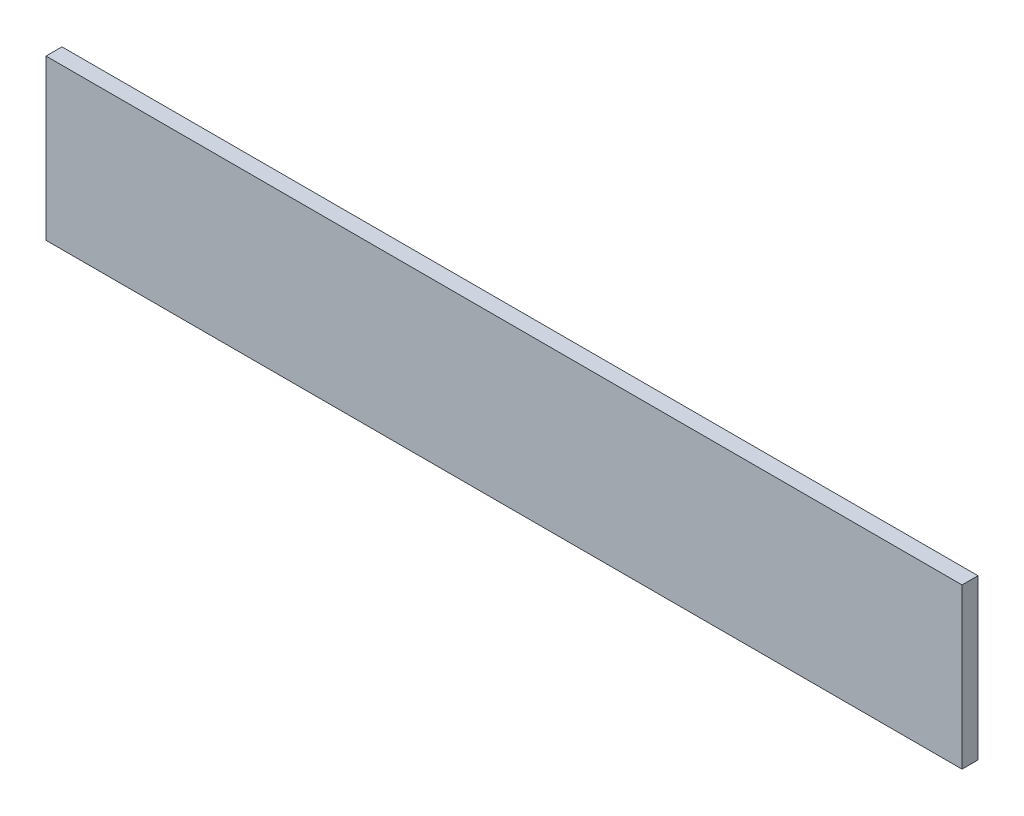
ISO-10303-21;
HEADER;
FILE_DESCRIPTION(('STEP AP214'),'2;1');
FILE_NAME('part.step','',(''),(''),'','','');
FILE_SCHEMA(('AUTOMOTIVE_DESIGN { 1 0 10303 214 1 1 1 1 }'));
ENDSEC;
DATA;
#1=APPLICATION_CONTEXT('core data for automotive mechanical design processes');
#2=APPLICATION_PROTOCOL_DEFINITION('international standard','automotive_design',2000,#1);
#3=PRODUCT_CONTEXT('',#1,'mechanical');
#4=PRODUCT('Part','Part','',(#3));
#5=PRODUCT_RELATED_PRODUCT_CATEGORY('part','',(#4));
#6=PRODUCT_DEFINITION_FORMATION('','',#4);
#7=PRODUCT_DEFINITION_CONTEXT('part definition',#1,'design');
#8=PRODUCT_DEFINITION('design','',#6,#7);
#9=PRODUCT_DEFINITION_SHAPE('','',#8);
#10=(LENGTH_UNIT() NAMED_UNIT(*) SI_UNIT(.MILLI.,.METRE.));
#11=(NAMED_UNIT(*) PLANE_ANGLE_UNIT() SI_UNIT($,.RADIAN.));
#12=(NAMED_UNIT(*) SI_UNIT($,.STERADIAN.) SOLID_ANGLE_UNIT());
#13=UNCERTAINTY_MEASURE_WITH_UNIT(LENGTH_MEASURE(1.E-05),#10,'distance_accuracy_value','');
#14=(GEOMETRIC_REPRESENTATION_CONTEXT(3) GLOBAL_UNCERTAINTY_ASSIGNED_CONTEXT((#13)) GLOBAL_UNIT_ASSIGNED_CONTEXT((#10,
#11,#12)) REPRESENTATION_CONTEXT('',''));
#15=CARTESIAN_POINT('',(0.,0.,0.));
#16=DIRECTION('',(0.,0.,1.));
#17=DIRECTION('',(1.,0.,0.));
#18=AXIS2_PLACEMENT_3D('',#15,#16,#17);
#19=CARTESIAN_POINT('',(-287.,50.,10.));
#20=DIRECTION('',(1.,0.,0.));
#21=DIRECTION('',(0.,0.,-1.));
#22=AXIS2_PLACEMENT_3D('',#19,#20,#21);
#23=PLANE('',#22);
#24=DIRECTION('',(0.,-1.,0.));
#25=VECTOR('',#24,1.);
#26=CARTESIAN_POINT('',(-287.,50.,0.));
#27=LINE('',#26,#25);
#28=CARTESIAN_POINT('',(-287.,50.,0.));
#29=VERTEX_POINT('',#28);
#30=CARTESIAN_POINT('',(-287.,-50.,0.));
#31=VERTEX_POINT('',#30);
#32=EDGE_CURVE('E101',#29,#31,#27,.T.);
#33=ORIENTED_EDGE('',*,*,#32,.T.);
#34=DIRECTION('',(0.,0.,-1.));
#35=VECTOR('',#34,1.);
#36=CARTESIAN_POINT('',(-287.,-50.,10.));
#37=LINE('',#36,#35);
#38=CARTESIAN_POINT('',(-287.,-50.,10.));
#39=VERTEX_POINT('',#38);
#40=EDGE_CURVE('E11',#39,#31,#37,.T.);
#41=ORIENTED_EDGE('',*,*,#40,.F.);
#42=DIRECTION('',(0.,-1.,0.));
#43=VECTOR('',#42,1.);
#44=CARTESIAN_POINT('',(-287.,50.,10.));
#45=LINE('',#44,#43);
#46=CARTESIAN_POINT('',(-287.,50.,10.));
#47=VERTEX_POINT('',#46);
#48=EDGE_CURVE('E89',#47,#39,#45,.T.);
#49=ORIENTED_EDGE('',*,*,#48,.F.);
#50=DIRECTION('',(0.,0.,-1.));
#51=VECTOR('',#50,1.);
#52=CARTESIAN_POINT('',(-287.,50.,10.));
#53=LINE('',#52,#51);
#54=EDGE_CURVE('E97',#47,#29,#53,.T.);
#55=ORIENTED_EDGE('',*,*,#54,.T.);
#56=EDGE_LOOP('',(#33,#41,#49,#55));
#57=FACE_BOUND('',#56,.T.);
#58=ADVANCED_FACE('F38',(#57),#23,.F.);
#59=CARTESIAN_POINT('',(-287.,-50.,10.));
#60=DIRECTION('',(0.,1.,0.));
#61=DIRECTION('',(-1.,0.,0.));
#62=AXIS2_PLACEMENT_3D('',#59,#60,#61);
#63=PLANE('',#62);
#64=DIRECTION('',(1.,0.,0.));
#65=VECTOR('',#64,1.);
#66=CARTESIAN_POINT('',(-287.,-50.,0.));
#67=LINE('',#66,#65);
#68=CARTESIAN_POINT('',(287.,-50.,0.));
#69=VERTEX_POINT('',#68);
#70=EDGE_CURVE('E93',#31,#69,#67,.T.);
#71=ORIENTED_EDGE('',*,*,#70,.T.);
#72=DIRECTION('',(0.,0.,-1.));
#73=VECTOR('',#72,1.);
#74=CARTESIAN_POINT('',(287.,-50.,10.));
#75=LINE('',#74,#73);
#76=CARTESIAN_POINT('',(287.,-50.,10.));
#77=VERTEX_POINT('',#76);
#78=EDGE_CURVE('E46',#77,#69,#75,.T.);
#79=ORIENTED_EDGE('',*,*,#78,.F.);
#80=DIRECTION('',(1.,0.,0.));
#81=VECTOR('',#80,1.);
#82=CARTESIAN_POINT('',(-287.,-50.,10.));
#83=LINE('',#82,#81);
#84=EDGE_CURVE('E84',#39,#77,#83,.T.);
#85=ORIENTED_EDGE('',*,*,#84,.F.);
#86=ORIENTED_EDGE('',*,*,#40,.T.);
#87=EDGE_LOOP('',(#71,#79,#85,#86));
#88=FACE_BOUND('',#87,.T.);
#89=ADVANCED_FACE('F92',(#88),#63,.F.);
#90=CARTESIAN_POINT('',(287.,50.,10.));
#91=DIRECTION('',(-1.,0.,0.));
#92=DIRECTION('',(0.,-1.,0.));
#93=AXIS2_PLACEMENT_3D('',#90,#91,#92);
#94=PLANE('',#93);
#95=DIRECTION('',(0.,1.,0.));
#96=VECTOR('',#95,1.);
#97=CARTESIAN_POINT('',(287.,50.,0.));
#98=LINE('',#97,#96);
#99=CARTESIAN_POINT('',(287.,50.,0.));
#100=VERTEX_POINT('',#99);
#101=EDGE_CURVE('E71',#69,#100,#98,.T.);
#102=ORIENTED_EDGE('',*,*,#101,.T.);
#103=DIRECTION('',(0.,0.,-1.));
#104=VECTOR('',#103,1.);
#105=CARTESIAN_POINT('',(287.,50.,10.));
#106=LINE('',#105,#104);
#107=CARTESIAN_POINT('',(287.,50.,10.));
#108=VERTEX_POINT('',#107);
#109=EDGE_CURVE('E94',#108,#100,#106,.T.);
#110=ORIENTED_EDGE('',*,*,#109,.F.);
#111=DIRECTION('',(0.,1.,0.));
#112=VECTOR('',#111,1.);
#113=CARTESIAN_POINT('',(287.,50.,10.));
#114=LINE('',#113,#112);
#115=EDGE_CURVE('E87',#77,#108,#114,.T.);
#116=ORIENTED_EDGE('',*,*,#115,.F.);
#117=ORIENTED_EDGE('',*,*,#78,.T.);
#118=EDGE_LOOP('',(#102,#110,#116,#117));
#119=FACE_BOUND('',#118,.T.);
#120=ADVANCED_FACE('F95',(#119),#94,.F.);
#121=CARTESIAN_POINT('',(-287.,50.,10.));
#122=DIRECTION('',(0.,-1.,0.));
#123=DIRECTION('',(0.,0.,-1.));
#124=AXIS2_PLACEMENT_3D('',#121,#122,#123);
#125=PLANE('',#124);
#126=DIRECTION('',(-1.,0.,0.));
#127=VECTOR('',#126,1.);
#128=CARTESIAN_POINT('',(-287.,50.,0.));
#129=LINE('',#128,#127);
#130=EDGE_CURVE('E77',#100,#29,#129,.T.);
#131=ORIENTED_EDGE('',*,*,#130,.T.);
#132=ORIENTED_EDGE('',*,*,#54,.F.);
#133=DIRECTION('',(-1.,0.,0.));
#134=VECTOR('',#133,1.);
#135=CARTESIAN_POINT('',(-287.,50.,10.));
#136=LINE('',#135,#134);
#137=EDGE_CURVE('E54',#108,#47,#136,.T.);
#138=ORIENTED_EDGE('',*,*,#137,.F.);
#139=ORIENTED_EDGE('',*,*,#109,.T.);
#140=EDGE_LOOP('',(#131,#132,#138,#139));
#141=FACE_BOUND('',#140,.T.);
#142=ADVANCED_FACE('F108',(#141),#125,.F.);
#143=CARTESIAN_POINT('',(0.,0.,10.));
#144=DIRECTION('',(0.,0.,1.));
#145=DIRECTION('',(1.,0.,0.));
#146=AXIS2_PLACEMENT_3D('',#143,#144,#145);
#147=PLANE('',#146);
#148=ORIENTED_EDGE('',*,*,#48,.T.);
#149=ORIENTED_EDGE('',*,*,#84,.T.);
#150=ORIENTED_EDGE('',*,*,#115,.T.);
#151=ORIENTED_EDGE('',*,*,#137,.T.);
#152=EDGE_LOOP('',(#148,#149,#150,#151));
#153=FACE_BOUND('',#152,.T.);
#154=ADVANCED_FACE('F85',(#153),#147,.T.);
#155=CARTESIAN_POINT('',(0.,0.,0.));
#156=DIRECTION('',(0.,0.,1.));
#157=DIRECTION('',(1.,0.,0.));
#158=AXIS2_PLACEMENT_3D('',#155,#156,#157);
#159=PLANE('',#158);
#160=ORIENTED_EDGE('',*,*,#32,.F.);
#161=ORIENTED_EDGE('',*,*,#130,.F.);
#162=ORIENTED_EDGE('',*,*,#101,.F.);
#163=ORIENTED_EDGE('',*,*,#70,.F.);
#164=EDGE_LOOP('',(#160,#161,#162,#163));
#165=FACE_BOUND('',#164,.T.);
#166=ADVANCED_FACE('F111',(#165),#159,.F.);
#167=CLOSED_SHELL('',(#58,#89,#120,#142,#154,#166));
#168=MANIFOLD_SOLID_BREP('B2',#167);
#169=ADVANCED_BREP_SHAPE_REPRESENTATION('',(#18,#168),#14);
#170=SHAPE_DEFINITION_REPRESENTATION(#9,#169);
ENDSEC;
END-ISO-10303-21;
